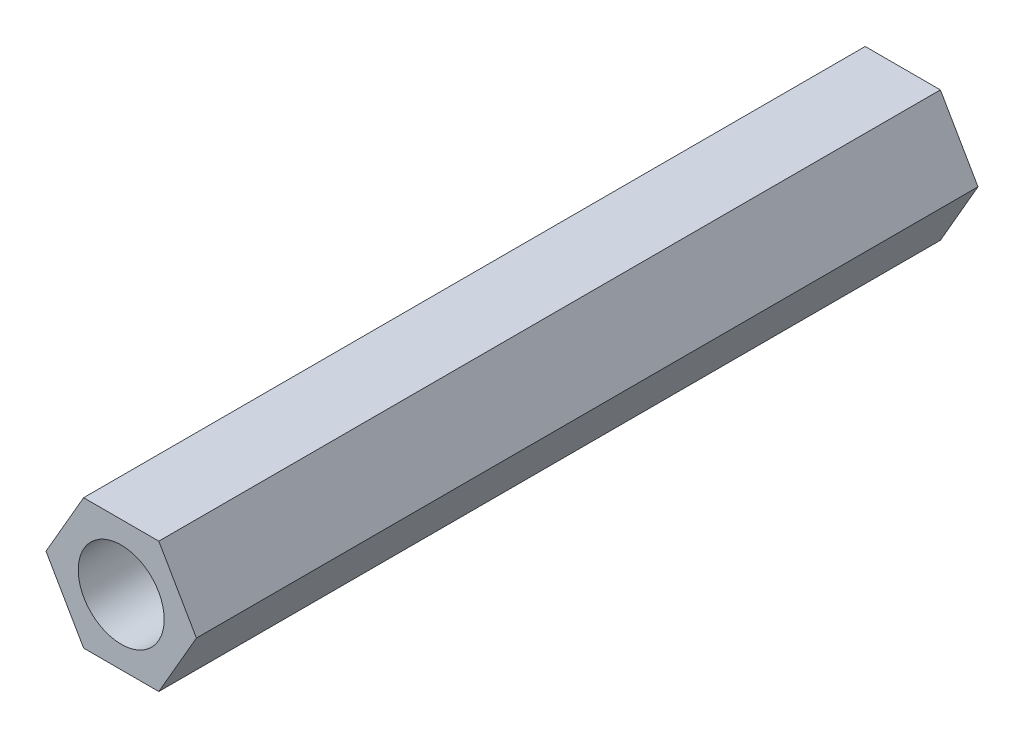
ISO-10303-21;
HEADER;
FILE_DESCRIPTION(('STEP AP214'),'2;1');
FILE_NAME('part.step','',(''),(''),'','','');
FILE_SCHEMA(('AUTOMOTIVE_DESIGN { 1 0 10303 214 1 1 1 1 }'));
ENDSEC;
DATA;
#1=APPLICATION_CONTEXT('core data for automotive mechanical design processes');
#2=APPLICATION_PROTOCOL_DEFINITION('international standard','automotive_design',2000,#1);
#3=PRODUCT_CONTEXT('',#1,'mechanical');
#4=PRODUCT('Part','Part','',(#3));
#5=PRODUCT_RELATED_PRODUCT_CATEGORY('part','',(#4));
#6=PRODUCT_DEFINITION_FORMATION('','',#4);
#7=PRODUCT_DEFINITION_CONTEXT('part definition',#1,'design');
#8=PRODUCT_DEFINITION('design','',#6,#7);
#9=PRODUCT_DEFINITION_SHAPE('','',#8);
#10=(LENGTH_UNIT() NAMED_UNIT(*) SI_UNIT(.MILLI.,.METRE.));
#11=(NAMED_UNIT(*) PLANE_ANGLE_UNIT() SI_UNIT($,.RADIAN.));
#12=(NAMED_UNIT(*) SI_UNIT($,.STERADIAN.) SOLID_ANGLE_UNIT());
#13=UNCERTAINTY_MEASURE_WITH_UNIT(LENGTH_MEASURE(1.E-05),#10,'distance_accuracy_value','');
#14=(GEOMETRIC_REPRESENTATION_CONTEXT(3) GLOBAL_UNCERTAINTY_ASSIGNED_CONTEXT((#13)) GLOBAL_UNIT_ASSIGNED_CONTEXT((#10,
#11,#12)) REPRESENTATION_CONTEXT('',''));
#15=CARTESIAN_POINT('',(0.,0.,0.));
#16=DIRECTION('',(0.,0.,1.));
#17=DIRECTION('',(1.,0.,0.));
#18=AXIS2_PLACEMENT_3D('',#15,#16,#17);
#19=CARTESIAN_POINT('',(0.,0.,30.));
#20=DIRECTION('',(0.,0.,1.));
#21=DIRECTION('',(1.,0.,0.));
#22=AXIS2_PLACEMENT_3D('',#19,#20,#21);
#23=PLANE('',#22);
#24=DIRECTION('',(0.5,0.866025403784439,0.));
#25=VECTOR('',#24,1.);
#26=CARTESIAN_POINT('',(1.44337567297406,-2.5,30.));
#27=LINE('',#26,#25);
#28=CARTESIAN_POINT('',(1.44337567297406,-2.5,30.));
#29=VERTEX_POINT('',#28);
#30=CARTESIAN_POINT('',(2.88675134594813,0.,30.));
#31=VERTEX_POINT('',#30);
#32=EDGE_CURVE('E135',#29,#31,#27,.T.);
#33=ORIENTED_EDGE('',*,*,#32,.T.);
#34=DIRECTION('',(-0.5,0.866025403784439,0.));
#35=VECTOR('',#34,1.);
#36=CARTESIAN_POINT('',(2.88675134594813,0.,30.));
#37=LINE('',#36,#35);
#38=CARTESIAN_POINT('',(1.44337567297406,2.5,30.));
#39=VERTEX_POINT('',#38);
#40=EDGE_CURVE('E93',#31,#39,#37,.T.);
#41=ORIENTED_EDGE('',*,*,#40,.T.);
#42=DIRECTION('',(-1.,0.,0.));
#43=VECTOR('',#42,1.);
#44=CARTESIAN_POINT('',(1.44337567297406,2.5,30.));
#45=LINE('',#44,#43);
#46=CARTESIAN_POINT('',(-1.44337567297406,2.5,30.));
#47=VERTEX_POINT('',#46);
#48=EDGE_CURVE('E106',#39,#47,#45,.T.);
#49=ORIENTED_EDGE('',*,*,#48,.T.);
#50=DIRECTION('',(-0.5,-0.866025403784439,0.));
#51=VECTOR('',#50,1.);
#52=CARTESIAN_POINT('',(-1.44337567297406,2.5,30.));
#53=LINE('',#52,#51);
#54=CARTESIAN_POINT('',(-2.88675134594813,0.,30.));
#55=VERTEX_POINT('',#54);
#56=EDGE_CURVE('E100',#47,#55,#53,.T.);
#57=ORIENTED_EDGE('',*,*,#56,.T.);
#58=DIRECTION('',(0.5,-0.866025403784439,0.));
#59=VECTOR('',#58,1.);
#60=CARTESIAN_POINT('',(-2.88675134594813,0.,30.));
#61=LINE('',#60,#59);
#62=CARTESIAN_POINT('',(-1.44337567297407,-2.5,30.));
#63=VERTEX_POINT('',#62);
#64=EDGE_CURVE('E104',#55,#63,#61,.T.);
#65=ORIENTED_EDGE('',*,*,#64,.T.);
#66=DIRECTION('',(1.,0.,0.));
#67=VECTOR('',#66,1.);
#68=CARTESIAN_POINT('',(-1.44337567297407,-2.5,30.));
#69=LINE('',#68,#67);
#70=EDGE_CURVE('E56',#63,#29,#69,.T.);
#71=ORIENTED_EDGE('',*,*,#70,.T.);
#72=EDGE_LOOP('',(#33,#41,#49,#57,#65,#71));
#73=FACE_BOUND('',#72,.T.);
#74=CARTESIAN_POINT('',(0.,0.,30.));
#75=DIRECTION('',(0.,0.,1.));
#76=DIRECTION('',(1.,0.,0.));
#77=AXIS2_PLACEMENT_3D('',#74,#75,#76);
#78=CIRCLE('',#77,1.65);
#79=CARTESIAN_POINT('',(1.65,0.,30.));
#80=VERTEX_POINT('',#79);
#81=EDGE_CURVE('E128',#80,#80,#78,.T.);
#82=ORIENTED_EDGE('',*,*,#81,.F.);
#83=EDGE_LOOP('',(#82));
#84=FACE_BOUND('',#83,.T.);
#85=ADVANCED_FACE('F39',(#73,#84),#23,.T.);
#86=CARTESIAN_POINT('',(0.,0.,0.));
#87=DIRECTION('',(0.,0.,1.));
#88=DIRECTION('',(1.,0.,0.));
#89=AXIS2_PLACEMENT_3D('',#86,#87,#88);
#90=PLANE('',#89);
#91=DIRECTION('',(0.5,0.866025403784439,0.));
#92=VECTOR('',#91,1.);
#93=CARTESIAN_POINT('',(1.44337567297406,-2.5,0.));
#94=LINE('',#93,#92);
#95=CARTESIAN_POINT('',(1.44337567297406,-2.5,0.));
#96=VERTEX_POINT('',#95);
#97=CARTESIAN_POINT('',(2.88675134594813,0.,0.));
#98=VERTEX_POINT('',#97);
#99=EDGE_CURVE('E124',#96,#98,#94,.T.);
#100=ORIENTED_EDGE('',*,*,#99,.F.);
#101=DIRECTION('',(1.,0.,0.));
#102=VECTOR('',#101,1.);
#103=CARTESIAN_POINT('',(-1.44337567297407,-2.5,0.));
#104=LINE('',#103,#102);
#105=CARTESIAN_POINT('',(-1.44337567297407,-2.5,0.));
#106=VERTEX_POINT('',#105);
#107=EDGE_CURVE('E85',#106,#96,#104,.T.);
#108=ORIENTED_EDGE('',*,*,#107,.F.);
#109=DIRECTION('',(0.5,-0.866025403784439,0.));
#110=VECTOR('',#109,1.);
#111=CARTESIAN_POINT('',(-2.88675134594813,0.,0.));
#112=LINE('',#111,#110);
#113=CARTESIAN_POINT('',(-2.88675134594813,0.,0.));
#114=VERTEX_POINT('',#113);
#115=EDGE_CURVE('E79',#114,#106,#112,.T.);
#116=ORIENTED_EDGE('',*,*,#115,.F.);
#117=DIRECTION('',(-0.5,-0.866025403784439,0.));
#118=VECTOR('',#117,1.);
#119=CARTESIAN_POINT('',(-1.44337567297406,2.5,0.));
#120=LINE('',#119,#118);
#121=CARTESIAN_POINT('',(-1.44337567297406,2.5,0.));
#122=VERTEX_POINT('',#121);
#123=EDGE_CURVE('E114',#122,#114,#120,.T.);
#124=ORIENTED_EDGE('',*,*,#123,.F.);
#125=DIRECTION('',(-1.,0.,0.));
#126=VECTOR('',#125,1.);
#127=CARTESIAN_POINT('',(1.44337567297406,2.5,0.));
#128=LINE('',#127,#126);
#129=CARTESIAN_POINT('',(1.44337567297406,2.5,0.));
#130=VERTEX_POINT('',#129);
#131=EDGE_CURVE('E130',#130,#122,#128,.T.);
#132=ORIENTED_EDGE('',*,*,#131,.F.);
#133=DIRECTION('',(-0.5,0.866025403784439,0.));
#134=VECTOR('',#133,1.);
#135=CARTESIAN_POINT('',(2.88675134594813,0.,0.));
#136=LINE('',#135,#134);
#137=EDGE_CURVE('E127',#98,#130,#136,.T.);
#138=ORIENTED_EDGE('',*,*,#137,.F.);
#139=EDGE_LOOP('',(#100,#108,#116,#124,#132,#138));
#140=FACE_BOUND('',#139,.T.);
#141=CARTESIAN_POINT('',(0.,0.,0.));
#142=DIRECTION('',(0.,0.,1.));
#143=DIRECTION('',(1.,0.,0.));
#144=AXIS2_PLACEMENT_3D('',#141,#142,#143);
#145=CIRCLE('',#144,1.65);
#146=CARTESIAN_POINT('',(1.65,0.,0.));
#147=VERTEX_POINT('',#146);
#148=EDGE_CURVE('E246',#147,#147,#145,.T.);
#149=ORIENTED_EDGE('',*,*,#148,.T.);
#150=EDGE_LOOP('',(#149));
#151=FACE_BOUND('',#150,.T.);
#152=ADVANCED_FACE('F144',(#140,#151),#90,.F.);
#153=CARTESIAN_POINT('',(1.44337567297406,-2.5,30.));
#154=DIRECTION('',(-0.866025403784439,0.5,0.));
#155=DIRECTION('',(-0.5,-0.866025403784439,0.));
#156=AXIS2_PLACEMENT_3D('',#153,#154,#155);
#157=PLANE('',#156);
#158=ORIENTED_EDGE('',*,*,#99,.T.);
#159=DIRECTION('',(0.,0.,-1.));
#160=VECTOR('',#159,1.);
#161=CARTESIAN_POINT('',(2.88675134594813,0.,30.));
#162=LINE('',#161,#160);
#163=EDGE_CURVE('E11',#31,#98,#162,.T.);
#164=ORIENTED_EDGE('',*,*,#163,.F.);
#165=ORIENTED_EDGE('',*,*,#32,.F.);
#166=DIRECTION('',(0.,0.,-1.));
#167=VECTOR('',#166,1.);
#168=CARTESIAN_POINT('',(1.44337567297406,-2.5,30.));
#169=LINE('',#168,#167);
#170=EDGE_CURVE('E120',#29,#96,#169,.T.);
#171=ORIENTED_EDGE('',*,*,#170,.T.);
#172=EDGE_LOOP('',(#158,#164,#165,#171));
#173=FACE_BOUND('',#172,.T.);
#174=ADVANCED_FACE('F41',(#173),#157,.F.);
#175=CARTESIAN_POINT('',(2.88675134594813,0.,30.));
#176=DIRECTION('',(-0.866025403784439,-0.5,0.));
#177=DIRECTION('',(0.5,-0.866025403784439,0.));
#178=AXIS2_PLACEMENT_3D('',#175,#176,#177);
#179=PLANE('',#178);
#180=ORIENTED_EDGE('',*,*,#137,.T.);
#181=DIRECTION('',(0.,0.,-1.));
#182=VECTOR('',#181,1.);
#183=CARTESIAN_POINT('',(1.44337567297406,2.5,30.));
#184=LINE('',#183,#182);
#185=EDGE_CURVE('E48',#39,#130,#184,.T.);
#186=ORIENTED_EDGE('',*,*,#185,.F.);
#187=ORIENTED_EDGE('',*,*,#40,.F.);
#188=ORIENTED_EDGE('',*,*,#163,.T.);
#189=EDGE_LOOP('',(#180,#186,#187,#188));
#190=FACE_BOUND('',#189,.T.);
#191=ADVANCED_FACE('F169',(#190),#179,.F.);
#192=CARTESIAN_POINT('',(1.44337567297406,2.5,30.));
#193=DIRECTION('',(0.,-1.,0.));
#194=DIRECTION('',(1.,0.,0.));
#195=AXIS2_PLACEMENT_3D('',#192,#193,#194);
#196=PLANE('',#195);
#197=ORIENTED_EDGE('',*,*,#131,.T.);
#198=DIRECTION('',(0.,0.,-1.));
#199=VECTOR('',#198,1.);
#200=CARTESIAN_POINT('',(-1.44337567297406,2.5,30.));
#201=LINE('',#200,#199);
#202=EDGE_CURVE('E115',#47,#122,#201,.T.);
#203=ORIENTED_EDGE('',*,*,#202,.F.);
#204=ORIENTED_EDGE('',*,*,#48,.F.);
#205=ORIENTED_EDGE('',*,*,#185,.T.);
#206=EDGE_LOOP('',(#197,#203,#204,#205));
#207=FACE_BOUND('',#206,.T.);
#208=ADVANCED_FACE('F141',(#207),#196,.F.);
#209=CARTESIAN_POINT('',(-1.44337567297406,2.5,30.));
#210=DIRECTION('',(0.866025403784439,-0.5,0.));
#211=DIRECTION('',(0.5,0.866025403784439,0.));
#212=AXIS2_PLACEMENT_3D('',#209,#210,#211);
#213=PLANE('',#212);
#214=ORIENTED_EDGE('',*,*,#123,.T.);
#215=DIRECTION('',(0.,0.,-1.));
#216=VECTOR('',#215,1.);
#217=CARTESIAN_POINT('',(-2.88675134594813,0.,30.));
#218=LINE('',#217,#216);
#219=EDGE_CURVE('E111',#55,#114,#218,.T.);
#220=ORIENTED_EDGE('',*,*,#219,.F.);
#221=ORIENTED_EDGE('',*,*,#56,.F.);
#222=ORIENTED_EDGE('',*,*,#202,.T.);
#223=EDGE_LOOP('',(#214,#220,#221,#222));
#224=FACE_BOUND('',#223,.T.);
#225=ADVANCED_FACE('F112',(#224),#213,.F.);
#226=CARTESIAN_POINT('',(-2.88675134594813,0.,30.));
#227=DIRECTION('',(0.866025403784439,0.5,0.));
#228=DIRECTION('',(-0.5,0.866025403784439,0.));
#229=AXIS2_PLACEMENT_3D('',#226,#227,#228);
#230=PLANE('',#229);
#231=ORIENTED_EDGE('',*,*,#115,.T.);
#232=DIRECTION('',(0.,0.,-1.));
#233=VECTOR('',#232,1.);
#234=CARTESIAN_POINT('',(-1.44337567297407,-2.5,30.));
#235=LINE('',#234,#233);
#236=EDGE_CURVE('E116',#63,#106,#235,.T.);
#237=ORIENTED_EDGE('',*,*,#236,.F.);
#238=ORIENTED_EDGE('',*,*,#64,.F.);
#239=ORIENTED_EDGE('',*,*,#219,.T.);
#240=EDGE_LOOP('',(#231,#237,#238,#239));
#241=FACE_BOUND('',#240,.T.);
#242=ADVANCED_FACE('F118',(#241),#230,.F.);
#243=CARTESIAN_POINT('',(-1.44337567297407,-2.5,30.));
#244=DIRECTION('',(0.,1.,0.));
#245=DIRECTION('',(-1.,0.,0.));
#246=AXIS2_PLACEMENT_3D('',#243,#244,#245);
#247=PLANE('',#246);
#248=ORIENTED_EDGE('',*,*,#107,.T.);
#249=ORIENTED_EDGE('',*,*,#170,.F.);
#250=ORIENTED_EDGE('',*,*,#70,.F.);
#251=ORIENTED_EDGE('',*,*,#236,.T.);
#252=EDGE_LOOP('',(#248,#249,#250,#251));
#253=FACE_BOUND('',#252,.T.);
#254=ADVANCED_FACE('F149',(#253),#247,.F.);
#255=CARTESIAN_POINT('',(0.,0.,30.));
#256=DIRECTION('',(0.,0.,-1.));
#257=DIRECTION('',(-1.,0.,0.));
#258=AXIS2_PLACEMENT_3D('',#255,#256,#257);
#259=CYLINDRICAL_SURFACE('',#258,1.65);
#260=ORIENTED_EDGE('',*,*,#81,.T.);
#261=EDGE_LOOP('',(#260));
#262=FACE_BOUND('',#261,.T.);
#263=ORIENTED_EDGE('',*,*,#148,.F.);
#264=EDGE_LOOP('',(#263));
#265=FACE_BOUND('',#264,.T.);
#266=ADVANCED_FACE('F151',(#262,#265),#259,.F.);
#267=CLOSED_SHELL('',(#85,#152,#174,#191,#208,#225,#242,#254,#266));
#268=MANIFOLD_SOLID_BREP('B2',#267);
#269=ADVANCED_BREP_SHAPE_REPRESENTATION('',(#18,#268),#14);
#270=SHAPE_DEFINITION_REPRESENTATION(#9,#269);
ENDSEC;
END-ISO-10303-21;
